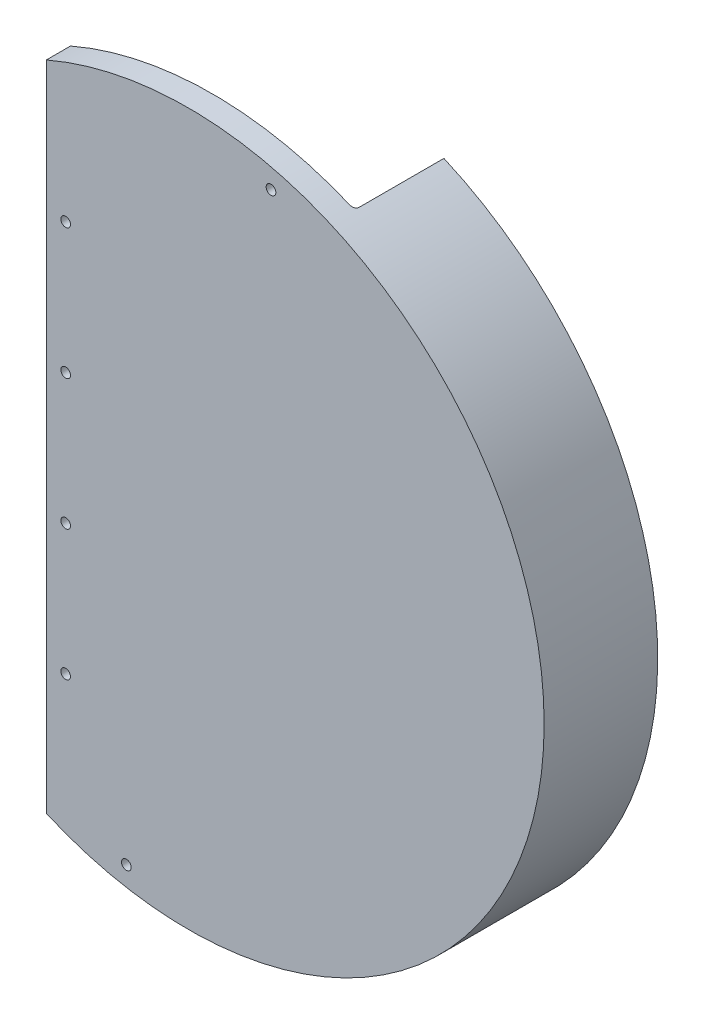
ISO-10303-21;
HEADER;
FILE_DESCRIPTION(('STEP AP214'),'2;1');
FILE_NAME('part.step','',(''),(''),'','','');
FILE_SCHEMA(('AUTOMOTIVE_DESIGN { 1 0 10303 214 1 1 1 1 }'));
ENDSEC;
DATA;
#1=APPLICATION_CONTEXT('core data for automotive mechanical design processes');
#2=APPLICATION_PROTOCOL_DEFINITION('international standard','automotive_design',2000,#1);
#3=PRODUCT_CONTEXT('',#1,'mechanical');
#4=PRODUCT('Part','Part','',(#3));
#5=PRODUCT_RELATED_PRODUCT_CATEGORY('part','',(#4));
#6=PRODUCT_DEFINITION_FORMATION('','',#4);
#7=PRODUCT_DEFINITION_CONTEXT('part definition',#1,'design');
#8=PRODUCT_DEFINITION('design','',#6,#7);
#9=PRODUCT_DEFINITION_SHAPE('','',#8);
#10=(LENGTH_UNIT() NAMED_UNIT(*) SI_UNIT(.MILLI.,.METRE.));
#11=(NAMED_UNIT(*) PLANE_ANGLE_UNIT() SI_UNIT($,.RADIAN.));
#12=(NAMED_UNIT(*) SI_UNIT($,.STERADIAN.) SOLID_ANGLE_UNIT());
#13=UNCERTAINTY_MEASURE_WITH_UNIT(LENGTH_MEASURE(1.E-05),#10,'distance_accuracy_value','');
#14=(GEOMETRIC_REPRESENTATION_CONTEXT(3) GLOBAL_UNCERTAINTY_ASSIGNED_CONTEXT((#13)) GLOBAL_UNIT_ASSIGNED_CONTEXT((#10,
#11,#12)) REPRESENTATION_CONTEXT('',''));
#15=CARTESIAN_POINT('',(0.,0.,0.));
#16=DIRECTION('',(0.,0.,1.));
#17=DIRECTION('',(1.,0.,0.));
#18=AXIS2_PLACEMENT_3D('',#15,#16,#17);
#19=CARTESIAN_POINT('',(29.3822815533981,0.,5.));
#20=DIRECTION('',(0.,0.,-1.));
#21=DIRECTION('',(-1.,0.,0.));
#22=AXIS2_PLACEMENT_3D('',#19,#20,#21);
#23=PLANE('',#22);
#24=CARTESIAN_POINT('',(29.3822815533981,0.,5.));
#25=DIRECTION('',(0.,0.,1.));
#26=DIRECTION('',(-1.,0.,0.));
#27=AXIS2_PLACEMENT_3D('',#24,#25,#26);
#28=CIRCLE('',#27,73.617718446602);
#29=CARTESIAN_POINT('',(0.,-67.5,5.));
#30=VERTEX_POINT('',#29);
#31=CARTESIAN_POINT('',(0.,67.5,5.));
#32=VERTEX_POINT('',#31);
#33=EDGE_CURVE('E164',#30,#32,#28,.T.);
#34=ORIENTED_EDGE('',*,*,#33,.T.);
#35=DIRECTION('',(0.,-1.,0.));
#36=VECTOR('',#35,1.);
#37=CARTESIAN_POINT('',(0.,-67.5,5.));
#38=LINE('',#37,#36);
#39=EDGE_CURVE('E167',#32,#30,#38,.T.);
#40=ORIENTED_EDGE('',*,*,#39,.T.);
#41=EDGE_LOOP('',(#34,#40));
#42=FACE_BOUND('',#41,.T.);
#43=CARTESIAN_POINT('',(4.,40.5,5.));
#44=DIRECTION('',(0.,0.,1.));
#45=DIRECTION('',(1.,0.,0.));
#46=AXIS2_PLACEMENT_3D('',#43,#44,#45);
#47=CIRCLE('',#46,1.);
#48=CARTESIAN_POINT('',(5.,40.5,5.));
#49=VERTEX_POINT('',#48);
#50=EDGE_CURVE('E158',#49,#49,#47,.T.);
#51=ORIENTED_EDGE('',*,*,#50,.F.);
#52=EDGE_LOOP('',(#51));
#53=FACE_BOUND('',#52,.T.);
#54=CARTESIAN_POINT('',(4.,13.5,5.));
#55=DIRECTION('',(0.,0.,1.));
#56=DIRECTION('',(1.,0.,0.));
#57=AXIS2_PLACEMENT_3D('',#54,#55,#56);
#58=CIRCLE('',#57,1.);
#59=CARTESIAN_POINT('',(5.,13.5,5.));
#60=VERTEX_POINT('',#59);
#61=EDGE_CURVE('E152',#60,#60,#58,.T.);
#62=ORIENTED_EDGE('',*,*,#61,.F.);
#63=EDGE_LOOP('',(#62));
#64=FACE_BOUND('',#63,.T.);
#65=CARTESIAN_POINT('',(4.,-13.5,5.));
#66=DIRECTION('',(0.,0.,1.));
#67=DIRECTION('',(1.,0.,0.));
#68=AXIS2_PLACEMENT_3D('',#65,#66,#67);
#69=CIRCLE('',#68,1.);
#70=CARTESIAN_POINT('',(5.,-13.5,5.));
#71=VERTEX_POINT('',#70);
#72=EDGE_CURVE('E146',#71,#71,#69,.T.);
#73=ORIENTED_EDGE('',*,*,#72,.F.);
#74=EDGE_LOOP('',(#73));
#75=FACE_BOUND('',#74,.T.);
#76=CARTESIAN_POINT('',(4.,-40.5,5.));
#77=DIRECTION('',(0.,0.,1.));
#78=DIRECTION('',(1.,0.,0.));
#79=AXIS2_PLACEMENT_3D('',#76,#77,#78);
#80=CIRCLE('',#79,1.);
#81=CARTESIAN_POINT('',(5.,-40.5,5.));
#82=VERTEX_POINT('',#81);
#83=EDGE_CURVE('E140',#82,#82,#80,.T.);
#84=ORIENTED_EDGE('',*,*,#83,.F.);
#85=EDGE_LOOP('',(#84));
#86=FACE_BOUND('',#85,.T.);
#87=CARTESIAN_POINT('',(46.4802958069296,67.4854401356053,5.));
#88=DIRECTION('',(0.,0.,1.));
#89=DIRECTION('',(1.,0.,0.));
#90=AXIS2_PLACEMENT_3D('',#87,#88,#89);
#91=CIRCLE('',#90,0.999999999999998);
#92=CARTESIAN_POINT('',(47.4802958069296,67.4854401356053,5.));
#93=VERTEX_POINT('',#92);
#94=EDGE_CURVE('E134',#93,#93,#91,.T.);
#95=ORIENTED_EDGE('',*,*,#94,.F.);
#96=EDGE_LOOP('',(#95));
#97=FACE_BOUND('',#96,.T.);
#98=CARTESIAN_POINT('',(16.5579140977151,-68.4222062930394,5.));
#99=DIRECTION('',(0.,0.,1.));
#100=DIRECTION('',(1.,0.,0.));
#101=AXIS2_PLACEMENT_3D('',#98,#99,#100);
#102=CIRCLE('',#101,1.);
#103=CARTESIAN_POINT('',(17.5579140977151,-68.4222062930394,5.));
#104=VERTEX_POINT('',#103);
#105=EDGE_CURVE('E125',#104,#104,#102,.T.);
#106=ORIENTED_EDGE('',*,*,#105,.F.);
#107=EDGE_LOOP('',(#106));
#108=FACE_BOUND('',#107,.T.);
#109=ADVANCED_FACE('F33',(#42,#53,#64,#75,#86,#97,#108),#23,.F.);
#110=CARTESIAN_POINT('',(29.3822815533981,0.,0.));
#111=DIRECTION('',(0.,0.,-1.));
#112=DIRECTION('',(-1.,0.,0.));
#113=AXIS2_PLACEMENT_3D('',#110,#111,#112);
#114=PLANE('',#113);
#115=CARTESIAN_POINT('',(29.3822815533981,0.,0.));
#116=DIRECTION('',(0.,0.,-1.));
#117=DIRECTION('',(-1.,0.,0.));
#118=AXIS2_PLACEMENT_3D('',#115,#116,#117);
#119=CIRCLE('',#118,64.6177184466019);
#120=CARTESIAN_POINT('',(54.2524984940228,59.6399349980412,0.));
#121=VERTEX_POINT('',#120);
#122=CARTESIAN_POINT('',(24.4137612488981,-64.4264180536842,0.));
#123=VERTEX_POINT('',#122);
#124=EDGE_CURVE('E183',#121,#123,#119,.T.);
#125=ORIENTED_EDGE('',*,*,#124,.T.);
#126=DIRECTION('',(0.0614519653496297,0.998110042006726,0.));
#127=VECTOR('',#126,1.);
#128=CARTESIAN_POINT('',(28.3841715113913,0.0614519653496297,0.));
#129=LINE('',#128,#127);
#130=CARTESIAN_POINT('',(23.8606354196594,-73.4103527661932,0.));
#131=VERTEX_POINT('',#130);
#132=EDGE_CURVE('E187',#123,#131,#129,.F.);
#133=ORIENTED_EDGE('',*,*,#132,.T.);
#134=CARTESIAN_POINT('',(29.3822815533981,0.,0.));
#135=DIRECTION('',(0.,0.,1.));
#136=DIRECTION('',(-1.,0.,0.));
#137=AXIS2_PLACEMENT_3D('',#134,#135,#136);
#138=CIRCLE('',#137,73.617718446602);
#139=CARTESIAN_POINT('',(0.,-67.5,0.));
#140=VERTEX_POINT('',#139);
#141=EDGE_CURVE('E171',#140,#131,#138,.T.);
#142=ORIENTED_EDGE('',*,*,#141,.F.);
#143=DIRECTION('',(0.,-1.,0.));
#144=VECTOR('',#143,1.);
#145=CARTESIAN_POINT('',(0.,-67.5,0.));
#146=LINE('',#145,#144);
#147=CARTESIAN_POINT('',(0.,67.5,0.));
#148=VERTEX_POINT('',#147);
#149=EDGE_CURVE('E168',#148,#140,#146,.T.);
#150=ORIENTED_EDGE('',*,*,#149,.F.);
#151=CARTESIAN_POINT('',(57.8449533921252,67.8928919776149,0.));
#152=VERTEX_POINT('',#151);
#153=EDGE_CURVE('E161',#152,#148,#138,.T.);
#154=ORIENTED_EDGE('',*,*,#153,.F.);
#155=DIRECTION('',(0.399119697993761,0.916898831209512,0.));
#156=VECTOR('',#155,1.);
#157=CARTESIAN_POINT('',(28.4653827221886,0.399119697993735,0.));
#158=LINE('',#157,#156);
#159=EDGE_CURVE('E185',#152,#121,#158,.F.);
#160=ORIENTED_EDGE('',*,*,#159,.T.);
#161=EDGE_LOOP('',(#125,#133,#142,#150,#154,#160));
#162=FACE_BOUND('',#161,.T.);
#163=CARTESIAN_POINT('',(46.4802958069296,67.4854401356053,0.));
#164=DIRECTION('',(0.,0.,1.));
#165=DIRECTION('',(1.,0.,0.));
#166=AXIS2_PLACEMENT_3D('',#163,#164,#165);
#167=CIRCLE('',#166,0.999999999999998);
#168=CARTESIAN_POINT('',(47.4802958069296,67.4854401356053,0.));
#169=VERTEX_POINT('',#168);
#170=EDGE_CURVE('E132',#169,#169,#167,.T.);
#171=ORIENTED_EDGE('',*,*,#170,.T.);
#172=EDGE_LOOP('',(#171));
#173=FACE_BOUND('',#172,.T.);
#174=CARTESIAN_POINT('',(4.,-13.5,0.));
#175=DIRECTION('',(0.,0.,1.));
#176=DIRECTION('',(1.,0.,0.));
#177=AXIS2_PLACEMENT_3D('',#174,#175,#176);
#178=CIRCLE('',#177,1.);
#179=CARTESIAN_POINT('',(5.,-13.5,0.));
#180=VERTEX_POINT('',#179);
#181=EDGE_CURVE('E143',#180,#180,#178,.T.);
#182=ORIENTED_EDGE('',*,*,#181,.T.);
#183=EDGE_LOOP('',(#182));
#184=FACE_BOUND('',#183,.T.);
#185=CARTESIAN_POINT('',(4.,40.5,0.));
#186=DIRECTION('',(0.,0.,1.));
#187=DIRECTION('',(1.,0.,0.));
#188=AXIS2_PLACEMENT_3D('',#185,#186,#187);
#189=CIRCLE('',#188,1.);
#190=CARTESIAN_POINT('',(5.,40.5,0.));
#191=VERTEX_POINT('',#190);
#192=EDGE_CURVE('E155',#191,#191,#189,.T.);
#193=ORIENTED_EDGE('',*,*,#192,.T.);
#194=EDGE_LOOP('',(#193));
#195=FACE_BOUND('',#194,.T.);
#196=CARTESIAN_POINT('',(4.,13.5,0.));
#197=DIRECTION('',(0.,0.,1.));
#198=DIRECTION('',(1.,0.,0.));
#199=AXIS2_PLACEMENT_3D('',#196,#197,#198);
#200=CIRCLE('',#199,1.);
#201=CARTESIAN_POINT('',(5.,13.5,0.));
#202=VERTEX_POINT('',#201);
#203=EDGE_CURVE('E149',#202,#202,#200,.T.);
#204=ORIENTED_EDGE('',*,*,#203,.T.);
#205=EDGE_LOOP('',(#204));
#206=FACE_BOUND('',#205,.T.);
#207=CARTESIAN_POINT('',(4.,-40.5,0.));
#208=DIRECTION('',(0.,0.,1.));
#209=DIRECTION('',(1.,0.,0.));
#210=AXIS2_PLACEMENT_3D('',#207,#208,#209);
#211=CIRCLE('',#210,1.);
#212=CARTESIAN_POINT('',(5.,-40.5,0.));
#213=VERTEX_POINT('',#212);
#214=EDGE_CURVE('E137',#213,#213,#211,.T.);
#215=ORIENTED_EDGE('',*,*,#214,.T.);
#216=EDGE_LOOP('',(#215));
#217=FACE_BOUND('',#216,.T.);
#218=CARTESIAN_POINT('',(16.5579140977151,-68.4222062930394,0.));
#219=DIRECTION('',(0.,0.,1.));
#220=DIRECTION('',(1.,0.,0.));
#221=AXIS2_PLACEMENT_3D('',#218,#219,#220);
#222=CIRCLE('',#221,1.);
#223=CARTESIAN_POINT('',(17.5579140977151,-68.4222062930394,0.));
#224=VERTEX_POINT('',#223);
#225=EDGE_CURVE('E122',#224,#224,#222,.T.);
#226=ORIENTED_EDGE('',*,*,#225,.T.);
#227=EDGE_LOOP('',(#226));
#228=FACE_BOUND('',#227,.T.);
#229=ADVANCED_FACE('F230',(#162,#173,#184,#195,#206,#217,#228),#114,.T.);
#230=CARTESIAN_POINT('',(29.3822815533981,0.,5.));
#231=DIRECTION('',(0.,0.,-1.));
#232=DIRECTION('',(-1.,0.,0.));
#233=AXIS2_PLACEMENT_3D('',#230,#231,#232);
#234=CYLINDRICAL_SURFACE('',#233,73.617718446602);
#235=ORIENTED_EDGE('',*,*,#141,.T.);
#236=CARTESIAN_POINT('',(23.8606354196594,-73.4103527661932,0.));
#237=CARTESIAN_POINT('',(23.8886906657597,-73.4124630651586,-1.86998433696166E-07));
#238=CARTESIAN_POINT('',(23.9167337040246,-73.4145560702759,-0.00118785150443525));
#239=CARTESIAN_POINT('',(23.9726215378856,-73.4186953785303,-0.00592603957088044));
#240=CARTESIAN_POINT('',(24.0004663428079,-73.4207416838747,-0.00947645121889103));
#241=CARTESIAN_POINT('',(24.0833555233053,-73.4267860309406,-0.0236382584854318));
#242=CARTESIAN_POINT('',(24.1378482625283,-73.4306965375792,-0.0377603191649787));
#243=CARTESIAN_POINT('',(24.2437021725151,-73.4381801007333,-0.0749753316180952));
#244=CARTESIAN_POINT('',(24.2950618169118,-73.4417529932294,-0.0980726161515396));
#245=CARTESIAN_POINT('',(24.3931887247773,-73.4484842665738,-0.152580321192886));
#246=CARTESIAN_POINT('',(24.4399567996683,-73.4516427206949,-0.18398926922506));
#247=CARTESIAN_POINT('',(24.5275687908697,-73.4574854267321,-0.254227537986636));
#248=CARTESIAN_POINT('',(24.5684130513522,-73.4601697061996,-0.293056427315181));
#249=CARTESIAN_POINT('',(24.6430294840952,-73.465021341775,-0.377044050038539));
#250=CARTESIAN_POINT('',(24.676800268755,-73.4671885964699,-0.422204022504082));
#251=CARTESIAN_POINT('',(24.7363037360457,-73.4709755740337,-0.517569536240014));
#252=CARTESIAN_POINT('',(24.7620346747956,-73.4725951781207,-0.567776169038161));
#253=CARTESIAN_POINT('',(24.8047069200256,-73.4752661762254,-0.671795300444252));
#254=CARTESIAN_POINT('',(24.8216533712081,-73.47631790284,-0.725605667596803));
#255=CARTESIAN_POINT('',(24.8420650189832,-73.4775814014971,-0.81645414632957));
#256=CARTESIAN_POINT('',(24.8481599494547,-73.4779575048601,-0.852920929066107));
#257=CARTESIAN_POINT('',(24.8562909531145,-73.4784586330055,-0.926253379621045));
#258=CARTESIAN_POINT('',(24.8583327766163,-73.4785840135008,-0.963118407612104));
#259=CARTESIAN_POINT('',(24.8583280702987,-73.4785840511772,-1.));
#260=B_SPLINE_CURVE_WITH_KNOTS('',3,(#236,#237,#238,#239,#240,#241,#242,#243,#244,#245,#246,
#247,#248,#249,#250,#251,#252,#253,#254,#255,#256,#257,#258,#259),.UNSPECIFIED.,.F.,.F.,(4,2,2,
2,2,2,2,2,2,2,2,4),(0.,0.0843516787633463,0.168699362461112,0.337116728104779,0.505615497886571,
0.674084436763749,0.842543583711118,1.01103574632881,1.1795644303723,1.34799430246802,
1.45870732595201,1.56926316362618),.UNSPECIFIED.);
#261=CARTESIAN_POINT('',(24.8583280702987,-73.4785840511772,-1.));
#262=VERTEX_POINT('',#261);
#263=EDGE_CURVE('E48',#131,#262,#260,.T.);
#264=ORIENTED_EDGE('',*,*,#263,.T.);
#265=DIRECTION('',(0.,0.,1.));
#266=VECTOR('',#265,1.);
#267=CARTESIAN_POINT('',(24.8583280702987,-73.4785840511772,-18.5));
#268=LINE('',#267,#266);
#269=CARTESIAN_POINT('',(24.8583280702987,-73.4785840511772,-18.5));
#270=VERTEX_POINT('',#269);
#271=EDGE_CURVE('E127',#270,#262,#268,.T.);
#272=ORIENTED_EDGE('',*,*,#271,.F.);
#273=CARTESIAN_POINT('',(29.3822815533981,0.,-18.5));
#274=DIRECTION('',(0.,0.,-1.));
#275=DIRECTION('',(-1.,0.,0.));
#276=AXIS2_PLACEMENT_3D('',#273,#274,#275);
#277=CIRCLE('',#276,73.617718446602);
#278=CARTESIAN_POINT('',(58.7645631067956,67.5000000000002,-18.5));
#279=VERTEX_POINT('',#278);
#280=EDGE_CURVE('E112',#279,#270,#277,.T.);
#281=ORIENTED_EDGE('',*,*,#280,.F.);
#282=DIRECTION('',(0.,0.,1.));
#283=VECTOR('',#282,1.);
#284=CARTESIAN_POINT('',(58.7645631067956,67.5000000000002,-18.5));
#285=LINE('',#284,#283);
#286=CARTESIAN_POINT('',(58.7645631067956,67.5000000000002,-1.));
#287=VERTEX_POINT('',#286);
#288=EDGE_CURVE('E109',#279,#287,#285,.T.);
#289=ORIENTED_EDGE('',*,*,#288,.T.);
#290=CARTESIAN_POINT('',(58.7645631067956,67.5000000000002,-1.));
#291=CARTESIAN_POINT('',(58.7645628979773,67.4999999891478,-0.971865299746314));
#292=CARTESIAN_POINT('',(58.7634737553387,67.5004741982474,-0.943744078192548));
#293=CARTESIAN_POINT('',(58.7591284805019,67.5023654564937,-0.887702865281121));
#294=CARTESIAN_POINT('',(58.755872452233,67.5037824604217,-0.859782864337344));
#295=CARTESIAN_POINT('',(58.7428844894177,67.5094331159386,-0.77667347438441));
#296=CARTESIAN_POINT('',(58.7299325930596,67.5150664530993,-0.722040785650213));
#297=CARTESIAN_POINT('',(58.6957951457873,67.5298951009699,-0.61592360277272));
#298=CARTESIAN_POINT('',(58.6746056414886,67.5390921219524,-0.564440633990942));
#299=CARTESIAN_POINT('',(58.6245869214595,67.5607636574864,-0.466084971201435));
#300=CARTESIAN_POINT('',(58.5957590515158,67.573237594682,-0.419211467055108));
#301=CARTESIAN_POINT('',(58.5312697787877,67.6010812377249,-0.331405538630814));
#302=CARTESIAN_POINT('',(58.4956084953773,67.6164508929863,-0.29047301059087));
#303=CARTESIAN_POINT('',(58.4184419655062,67.6496239284124,-0.215699657254769));
#304=CARTESIAN_POINT('',(58.376935581732,67.6674277821929,-0.181860215295826));
#305=CARTESIAN_POINT('',(58.2892494491346,67.7049329702665,-0.122240590925215));
#306=CARTESIAN_POINT('',(58.2430689397369,67.7246346133431,-0.0964617229315657));
#307=CARTESIAN_POINT('',(58.1473466681906,67.7653465685421,-0.0537117727791903));
#308=CARTESIAN_POINT('',(58.0978068898452,67.7863561077013,-0.0367355426060339));
#309=CARTESIAN_POINT('',(58.0141301475991,67.8217296773712,-0.0162893131729054));
#310=CARTESIAN_POINT('',(57.9805329626771,67.8359036069634,-0.0101844518365974));
#311=CARTESIAN_POINT('',(57.9129499939178,67.8643557660122,-0.0020403303401269));
#312=CARTESIAN_POINT('',(57.8789648302506,67.8786338185994,4.69579952636378E-06));
#313=CARTESIAN_POINT('',(57.8449533921252,67.8928919776149,0.));
#314=B_SPLINE_CURVE_WITH_KNOTS('',3,(#290,#291,#292,#293,#294,#295,#296,#297,#298,#299,#300,
#301,#302,#303,#304,#305,#306,#307,#308,#309,#310,#311,#312,#313),.UNSPECIFIED.,.F.,.F.,(4,2,2,
2,2,2,2,2,2,2,2,4),(0.,0.0843522575803629,0.168700469711783,0.337118742098371,0.505617941591119,
0.674087473300527,0.842554062255195,1.01105347609206,1.17958035240264,1.34800855827989,
1.45871452118311,1.56926314117616),.UNSPECIFIED.);
#315=EDGE_CURVE('E11',#287,#152,#314,.T.);
#316=ORIENTED_EDGE('',*,*,#315,.T.);
#317=ORIENTED_EDGE('',*,*,#153,.T.);
#318=DIRECTION('',(0.,0.,-1.));
#319=VECTOR('',#318,1.);
#320=CARTESIAN_POINT('',(0.,67.5,5.));
#321=LINE('',#320,#319);
#322=EDGE_CURVE('E177',#32,#148,#321,.T.);
#323=ORIENTED_EDGE('',*,*,#322,.F.);
#324=ORIENTED_EDGE('',*,*,#33,.F.);
#325=DIRECTION('',(0.,0.,-1.));
#326=VECTOR('',#325,1.);
#327=CARTESIAN_POINT('',(0.,-67.5,5.));
#328=LINE('',#327,#326);
#329=EDGE_CURVE('E170',#30,#140,#328,.T.);
#330=ORIENTED_EDGE('',*,*,#329,.T.);
#331=EDGE_LOOP('',(#235,#264,#272,#281,#289,#316,#317,#323,#324,#330));
#332=FACE_BOUND('',#331,.T.);
#333=ADVANCED_FACE('F200',(#332),#234,.T.);
#334=CARTESIAN_POINT('',(0.,-67.5,5.));
#335=DIRECTION('',(1.,0.,0.));
#336=DIRECTION('',(0.,1.,0.));
#337=AXIS2_PLACEMENT_3D('',#334,#335,#336);
#338=PLANE('',#337);
#339=ORIENTED_EDGE('',*,*,#149,.T.);
#340=ORIENTED_EDGE('',*,*,#329,.F.);
#341=ORIENTED_EDGE('',*,*,#39,.F.);
#342=ORIENTED_EDGE('',*,*,#322,.T.);
#343=EDGE_LOOP('',(#339,#340,#341,#342));
#344=FACE_BOUND('',#343,.T.);
#345=ADVANCED_FACE('F235',(#344),#338,.F.);
#346=CARTESIAN_POINT('',(4.,40.5,5.));
#347=DIRECTION('',(0.,0.,-1.));
#348=DIRECTION('',(-1.,0.,0.));
#349=AXIS2_PLACEMENT_3D('',#346,#347,#348);
#350=CYLINDRICAL_SURFACE('',#349,1.);
#351=ORIENTED_EDGE('',*,*,#50,.T.);
#352=EDGE_LOOP('',(#351));
#353=FACE_BOUND('',#352,.T.);
#354=ORIENTED_EDGE('',*,*,#192,.F.);
#355=EDGE_LOOP('',(#354));
#356=FACE_BOUND('',#355,.T.);
#357=ADVANCED_FACE('F267',(#353,#356),#350,.F.);
#358=CARTESIAN_POINT('',(4.,13.5,5.));
#359=DIRECTION('',(0.,0.,-1.));
#360=DIRECTION('',(-1.,0.,0.));
#361=AXIS2_PLACEMENT_3D('',#358,#359,#360);
#362=CYLINDRICAL_SURFACE('',#361,1.);
#363=ORIENTED_EDGE('',*,*,#61,.T.);
#364=EDGE_LOOP('',(#363));
#365=FACE_BOUND('',#364,.T.);
#366=ORIENTED_EDGE('',*,*,#203,.F.);
#367=EDGE_LOOP('',(#366));
#368=FACE_BOUND('',#367,.T.);
#369=ADVANCED_FACE('F271',(#365,#368),#362,.F.);
#370=CARTESIAN_POINT('',(4.,-13.5,5.));
#371=DIRECTION('',(0.,0.,-1.));
#372=DIRECTION('',(-1.,0.,0.));
#373=AXIS2_PLACEMENT_3D('',#370,#371,#372);
#374=CYLINDRICAL_SURFACE('',#373,1.);
#375=ORIENTED_EDGE('',*,*,#72,.T.);
#376=EDGE_LOOP('',(#375));
#377=FACE_BOUND('',#376,.T.);
#378=ORIENTED_EDGE('',*,*,#181,.F.);
#379=EDGE_LOOP('',(#378));
#380=FACE_BOUND('',#379,.T.);
#381=ADVANCED_FACE('F276',(#377,#380),#374,.F.);
#382=CARTESIAN_POINT('',(4.,-40.5,5.));
#383=DIRECTION('',(0.,0.,-1.));
#384=DIRECTION('',(-1.,0.,0.));
#385=AXIS2_PLACEMENT_3D('',#382,#383,#384);
#386=CYLINDRICAL_SURFACE('',#385,1.);
#387=ORIENTED_EDGE('',*,*,#83,.T.);
#388=EDGE_LOOP('',(#387));
#389=FACE_BOUND('',#388,.T.);
#390=ORIENTED_EDGE('',*,*,#214,.F.);
#391=EDGE_LOOP('',(#390));
#392=FACE_BOUND('',#391,.T.);
#393=ADVANCED_FACE('F283',(#389,#392),#386,.F.);
#394=CARTESIAN_POINT('',(46.4802958069296,67.4854401356053,5.));
#395=DIRECTION('',(0.,0.,-1.));
#396=DIRECTION('',(-1.,0.,0.));
#397=AXIS2_PLACEMENT_3D('',#394,#395,#396);
#398=CYLINDRICAL_SURFACE('',#397,0.999999999999998);
#399=ORIENTED_EDGE('',*,*,#94,.T.);
#400=EDGE_LOOP('',(#399));
#401=FACE_BOUND('',#400,.T.);
#402=ORIENTED_EDGE('',*,*,#170,.F.);
#403=EDGE_LOOP('',(#402));
#404=FACE_BOUND('',#403,.T.);
#405=ADVANCED_FACE('F256',(#401,#404),#398,.F.);
#406=CARTESIAN_POINT('',(16.5579140977151,-68.4222062930394,5.));
#407=DIRECTION('',(0.,0.,-1.));
#408=DIRECTION('',(-1.,0.,0.));
#409=AXIS2_PLACEMENT_3D('',#406,#407,#408);
#410=CYLINDRICAL_SURFACE('',#409,1.);
#411=ORIENTED_EDGE('',*,*,#105,.T.);
#412=EDGE_LOOP('',(#411));
#413=FACE_BOUND('',#412,.T.);
#414=ORIENTED_EDGE('',*,*,#225,.F.);
#415=EDGE_LOOP('',(#414));
#416=FACE_BOUND('',#415,.T.);
#417=ADVANCED_FACE('F253',(#413,#416),#410,.F.);
#418=CARTESIAN_POINT('',(29.3822815533981,0.,-18.5));
#419=DIRECTION('',(0.,0.,1.));
#420=DIRECTION('',(1.,0.,0.));
#421=AXIS2_PLACEMENT_3D('',#418,#419,#420);
#422=CYLINDRICAL_SURFACE('',#421,65.6177184466019);
#423=DIRECTION('',(0.,0.,1.));
#424=VECTOR('',#423,1.);
#425=CARTESIAN_POINT('',(25.3499437930957,-65.4937037151234,-18.5));
#426=LINE('',#425,#424);
#427=CARTESIAN_POINT('',(25.3499437930957,-65.4937037151234,-18.5));
#428=VERTEX_POINT('',#427);
#429=CARTESIAN_POINT('',(25.3499437930957,-65.4937037151234,-1.));
#430=VERTEX_POINT('',#429);
#431=EDGE_CURVE('E403',#428,#430,#426,.T.);
#432=ORIENTED_EDGE('',*,*,#431,.T.);
#433=CARTESIAN_POINT('',(29.3822815533981,0.,-1.));
#434=DIRECTION('',(0.,0.,-1.));
#435=DIRECTION('',(-1.,0.,0.));
#436=AXIS2_PLACEMENT_3D('',#433,#434,#435);
#437=CIRCLE('',#436,65.6177184466019);
#438=CARTESIAN_POINT('',(55.5716055228455,60.1648093503241,-1.));
#439=VERTEX_POINT('',#438);
#440=EDGE_CURVE('E56',#430,#439,#437,.F.);
#441=ORIENTED_EDGE('',*,*,#440,.T.);
#442=DIRECTION('',(0.,0.,1.));
#443=VECTOR('',#442,1.);
#444=CARTESIAN_POINT('',(55.5716055228455,60.1648093503241,-18.5));
#445=LINE('',#444,#443);
#446=CARTESIAN_POINT('',(55.5716055228455,60.1648093503241,-18.5));
#447=VERTEX_POINT('',#446);
#448=EDGE_CURVE('E108',#447,#439,#445,.T.);
#449=ORIENTED_EDGE('',*,*,#448,.F.);
#450=CARTESIAN_POINT('',(29.3822815533981,0.,-18.5));
#451=DIRECTION('',(0.,0.,1.));
#452=DIRECTION('',(-1.,0.,0.));
#453=AXIS2_PLACEMENT_3D('',#450,#451,#452);
#454=CIRCLE('',#453,65.6177184466019);
#455=EDGE_CURVE('E113',#428,#447,#454,.T.);
#456=ORIENTED_EDGE('',*,*,#455,.F.);
#457=EDGE_LOOP('',(#432,#441,#449,#456));
#458=FACE_BOUND('',#457,.T.);
#459=ADVANCED_FACE('F121',(#458),#422,.F.);
#460=CARTESIAN_POINT('',(58.7645631067956,67.5000000000002,-18.5));
#461=DIRECTION('',(0.916898831209512,-0.399119697993761,0.));
#462=DIRECTION('',(0.399119697993761,0.916898831209512,0.));
#463=AXIS2_PLACEMENT_3D('',#460,#461,#462);
#464=PLANE('',#463);
#465=ORIENTED_EDGE('',*,*,#448,.T.);
#466=DIRECTION('',(0.399119697993761,0.916898831209512,0.));
#467=VECTOR('',#466,1.);
#468=CARTESIAN_POINT('',(58.7645631067956,67.5000000000002,-1.));
#469=LINE('',#468,#467);
#470=EDGE_CURVE('E63',#439,#287,#469,.T.);
#471=ORIENTED_EDGE('',*,*,#470,.T.);
#472=ORIENTED_EDGE('',*,*,#288,.F.);
#473=DIRECTION('',(0.399119697993762,0.916898831209512,0.));
#474=VECTOR('',#473,1.);
#475=CARTESIAN_POINT('',(58.7645631067956,67.5000000000002,-18.5));
#476=LINE('',#475,#474);
#477=EDGE_CURVE('E105',#447,#279,#476,.T.);
#478=ORIENTED_EDGE('',*,*,#477,.F.);
#479=EDGE_LOOP('',(#465,#471,#472,#478));
#480=FACE_BOUND('',#479,.T.);
#481=ADVANCED_FACE('F107',(#480),#464,.F.);
#482=CARTESIAN_POINT('',(25.3499437930957,-65.4937037151234,-18.5));
#483=DIRECTION('',(0.998110042006726,-0.0614519653496296,0.));
#484=DIRECTION('',(0.0614519653496297,0.998110042006726,0.));
#485=AXIS2_PLACEMENT_3D('',#482,#483,#484);
#486=PLANE('',#485);
#487=ORIENTED_EDGE('',*,*,#271,.T.);
#488=DIRECTION('',(0.0614519653496297,0.998110042006726,0.));
#489=VECTOR('',#488,1.);
#490=CARTESIAN_POINT('',(25.3499437930957,-65.4937037151234,-1.));
#491=LINE('',#490,#489);
#492=EDGE_CURVE('E180',#262,#430,#491,.T.);
#493=ORIENTED_EDGE('',*,*,#492,.T.);
#494=ORIENTED_EDGE('',*,*,#431,.F.);
#495=DIRECTION('',(0.0614519653496297,0.998110042006726,0.));
#496=VECTOR('',#495,1.);
#497=CARTESIAN_POINT('',(25.3499437930957,-65.4937037151234,-18.5));
#498=LINE('',#497,#496);
#499=EDGE_CURVE('E118',#270,#428,#498,.T.);
#500=ORIENTED_EDGE('',*,*,#499,.F.);
#501=EDGE_LOOP('',(#487,#493,#494,#500));
#502=FACE_BOUND('',#501,.T.);
#503=ADVANCED_FACE('F295',(#502),#486,.F.);
#504=CARTESIAN_POINT('',(29.3822815533981,0.,-18.5));
#505=DIRECTION('',(0.,0.,-1.));
#506=DIRECTION('',(-1.,0.,0.));
#507=AXIS2_PLACEMENT_3D('',#504,#505,#506);
#508=PLANE('',#507);
#509=ORIENTED_EDGE('',*,*,#455,.T.);
#510=ORIENTED_EDGE('',*,*,#477,.T.);
#511=ORIENTED_EDGE('',*,*,#280,.T.);
#512=ORIENTED_EDGE('',*,*,#499,.T.);
#513=EDGE_LOOP('',(#509,#510,#511,#512));
#514=FACE_BOUND('',#513,.T.);
#515=ADVANCED_FACE('F116',(#514),#508,.T.);
#516=CARTESIAN_POINT('',(57.8476642755861,67.899119697994,-1.));
#517=DIRECTION('',(0.399119697993761,0.916898831209512,0.));
#518=DIRECTION('',(-0.916898831209512,0.399119697993761,0.));
#519=AXIS2_PLACEMENT_3D('',#516,#517,#518);
#520=CYLINDRICAL_SURFACE('',#519,1.);
#521=ORIENTED_EDGE('',*,*,#315,.F.);
#522=ORIENTED_EDGE('',*,*,#470,.F.);
#523=CARTESIAN_POINT('',(55.5716055228455,60.1648093503241,-1.));
#524=CARTESIAN_POINT('',(55.5716094758275,60.1648108726729,-0.977582448986956));
#525=CARTESIAN_POINT('',(55.5706126095736,60.1644186976479,-0.95517872523887));
#526=CARTESIAN_POINT('',(55.5666635408446,60.1628648972706,-0.910588225587027));
#527=CARTESIAN_POINT('',(55.5637128555464,60.161703868947,-0.88840129489389));
#528=CARTESIAN_POINT('',(55.5520701785916,60.1571222258025,-0.822808905890791));
#529=CARTESIAN_POINT('',(55.5405856032005,60.1526022901184,-0.779946020493947));
#530=CARTESIAN_POINT('',(55.5110566192447,60.1409752172491,-0.697122109490422));
#531=CARTESIAN_POINT('',(55.4930300971566,60.1338751344287,-0.657153524561603));
#532=CARTESIAN_POINT('',(55.4514872980205,60.1175027649513,-0.580592662849101));
#533=CARTESIAN_POINT('',(55.4279587457747,60.1082256210386,-0.544008194639315));
#534=CARTESIAN_POINT('',(55.3660518869944,60.0837984429261,-0.460524403990546));
#535=CARTESIAN_POINT('',(55.3255238055431,60.0677935631026,-0.415471662860651));
#536=CARTESIAN_POINT('',(55.2383061390184,60.0333088798623,-0.332933752908292));
#537=CARTESIAN_POINT('',(55.1916049383006,60.0148244097288,-0.295463196093));
#538=CARTESIAN_POINT('',(55.0748767733582,59.9685618400122,-0.214575904876861));
#539=CARTESIAN_POINT('',(55.0028477103657,59.9399674651434,-0.174524658946073));
#540=CARTESIAN_POINT('',(54.8538792814765,59.8807112324919,-0.107237639676295));
#541=CARTESIAN_POINT('',(54.7769339199971,59.850046847588,-0.0800178670351628));
#542=CARTESIAN_POINT('',(54.6266625807423,59.7900371070019,-0.0391808642956085));
#543=CARTESIAN_POINT('',(54.5535429772285,59.7607839149121,-0.0246459579367433));
#544=CARTESIAN_POINT('',(54.4063762664369,59.7017933978477,-0.00519429839514037));
#545=CARTESIAN_POINT('',(54.3323313632767,59.6720571860423,-0.000257924527852063));
#546=CARTESIAN_POINT('',(54.2564102424821,59.6415090739535,-3.28655587227387E-06));
#547=CARTESIAN_POINT('',(54.2544543346672,59.6407220424217,-4.84473381061299E-09));
#548=CARTESIAN_POINT('',(54.2524984940228,59.6399349980412,0.));
#549=B_SPLINE_CURVE_WITH_KNOTS('',3,(#523,#524,#525,#526,#527,#528,#529,#530,#531,#532,#533,
#534,#535,#536,#537,#538,#539,#540,#541,#542,#543,#544,#545,#546,#547,#548),.UNSPECIFIED.,.F.,
.F.,(4,2,2,2,2,2,2,2,2,2,2,2,4),(0.,0.0672009165102551,0.1343497113587,0.26738986213439,
0.400068972148672,0.533046966068614,0.72004127149174,0.907392581100102,1.16769188718214,
1.42831493040819,1.66798431020028,1.9071632565375,1.91348819825553),.UNSPECIFIED.);
#550=EDGE_CURVE('E38',#121,#439,#549,.F.);
#551=ORIENTED_EDGE('',*,*,#550,.F.);
#552=ORIENTED_EDGE('',*,*,#159,.F.);
#553=EDGE_LOOP('',(#521,#522,#551,#552));
#554=FACE_BOUND('',#553,.T.);
#555=ADVANCED_FACE('F35',(#554),#520,.F.);
#556=CARTESIAN_POINT('',(29.3822815533981,0.,-1.));
#557=DIRECTION('',(0.,0.,-1.));
#558=DIRECTION('',(-1.,0.,0.));
#559=AXIS2_PLACEMENT_3D('',#556,#557,#558);
#560=TOROIDAL_SURFACE('',#559,64.6177184466019,1.);
#561=ORIENTED_EDGE('',*,*,#550,.T.);
#562=ORIENTED_EDGE('',*,*,#440,.F.);
#563=CARTESIAN_POINT('',(25.3499437930957,-65.4937037151234,-1.));
#564=CARTESIAN_POINT('',(25.3499466215484,-65.4937068684498,-0.977582448986956));
#565=CARTESIAN_POINT('',(25.3492370994908,-65.4929042963171,-0.955178725238872));
#566=CARTESIAN_POINT('',(25.3464264334383,-65.4897247372627,-0.910588225587028));
#567=CARTESIAN_POINT('',(25.3443263692252,-65.4873489719549,-0.888401294893891));
#568=CARTESIAN_POINT('',(25.3360402660242,-65.4779743319981,-0.822808905890792));
#569=CARTESIAN_POINT('',(25.3278669152426,-65.4687265415861,-0.779946020493948));
#570=CARTESIAN_POINT('',(25.3068541968226,-65.4449438718122,-0.697122109490422));
#571=CARTESIAN_POINT('',(25.2940275518876,-65.4304234085153,-0.657153524561604));
#572=CARTESIAN_POINT('',(25.2644725949659,-65.3969515820977,-0.580592662849103));
#573=CARTESIAN_POINT('',(25.2477355588521,-65.377990311252,-0.544008194639317));
#574=CARTESIAN_POINT('',(25.2037061782815,-65.3280848021256,-0.460524403990546));
#575=CARTESIAN_POINT('',(25.1748878673025,-65.2954016793158,-0.415471662860644));
#576=CARTESIAN_POINT('',(25.1128889424606,-65.2250294685317,-0.332933752908283));
#577=CARTESIAN_POINT('',(25.0797001052546,-65.1873309424397,-0.295463196092995));
#578=CARTESIAN_POINT('',(24.996773502486,-65.0930501469356,-0.21457590487686));
#579=CARTESIAN_POINT('',(24.9456237582325,-65.0348304951632,-0.174524658946067));
#580=CARTESIAN_POINT('',(24.8398910676978,-64.9143170433577,-0.107237639676286));
#581=CARTESIAN_POINT('',(24.7853039306244,-64.8520182663163,-0.0800178670351567));
#582=CARTESIAN_POINT('',(24.678753445046,-64.7302412636037,-0.0391808642956052));
#583=CARTESIAN_POINT('',(24.6269319937931,-64.6709389630117,-0.0246459579367408));
#584=CARTESIAN_POINT('',(24.5226831603997,-64.5514814282771,-0.00519429839513975));
#585=CARTESIAN_POINT('',(24.470257235163,-64.4913281878024,-0.000257924527851694));
#586=CARTESIAN_POINT('',(24.416529456553,-64.4295987010028,-3.28655587226655E-06));
#587=CARTESIAN_POINT('',(24.4151453198919,-64.4280083677938,-4.84473381240116E-09));
#588=CARTESIAN_POINT('',(24.4137612488981,-64.4264180536842,0.));
#589=B_SPLINE_CURVE_WITH_KNOTS('',3,(#563,#564,#565,#566,#567,#568,#569,#570,#571,#572,#573,
#574,#575,#576,#577,#578,#579,#580,#581,#582,#583,#584,#585,#586,#587,#588),.UNSPECIFIED.,.F.,
.F.,(4,2,2,2,2,2,2,2,2,2,2,2,4),(0.,0.0672009165102531,0.134349711358699,0.26738986213439,
0.400068972148676,0.533046966068617,0.720041271491746,0.907392581100115,1.16769188718215,
1.4283149304082,1.66798431020031,1.90716325653752,1.91348819825554),.UNSPECIFIED.);
#590=EDGE_CURVE('E210',#123,#430,#589,.F.);
#591=ORIENTED_EDGE('',*,*,#590,.F.);
#592=ORIENTED_EDGE('',*,*,#124,.F.);
#593=EDGE_LOOP('',(#561,#562,#591,#592));
#594=FACE_BOUND('',#593,.T.);
#595=ADVANCED_FACE('F206',(#594),#560,.F.);
#596=CARTESIAN_POINT('',(24.351833751089,-65.4322517497737,-1.));
#597=DIRECTION('',(0.0614519653496297,0.998110042006726,0.));
#598=DIRECTION('',(-0.998110042006726,0.0614519653496297,0.));
#599=AXIS2_PLACEMENT_3D('',#596,#597,#598);
#600=CYLINDRICAL_SURFACE('',#599,1.);
#601=ORIENTED_EDGE('',*,*,#263,.F.);
#602=ORIENTED_EDGE('',*,*,#132,.F.);
#603=ORIENTED_EDGE('',*,*,#590,.T.);
#604=ORIENTED_EDGE('',*,*,#492,.F.);
#605=EDGE_LOOP('',(#601,#602,#603,#604));
#606=FACE_BOUND('',#605,.T.);
#607=ADVANCED_FACE('F203',(#606),#600,.F.);
#608=CLOSED_SHELL('',(#109,#229,#333,#345,#357,#369,#381,#393,#405,#417,#459,#481,#503,#515,
#555,#595,#607));
#609=MANIFOLD_SOLID_BREP('B2',#608);
#610=ADVANCED_BREP_SHAPE_REPRESENTATION('',(#18,#609),#14);
#611=SHAPE_DEFINITION_REPRESENTATION(#9,#610);
ENDSEC;
END-ISO-10303-21;
